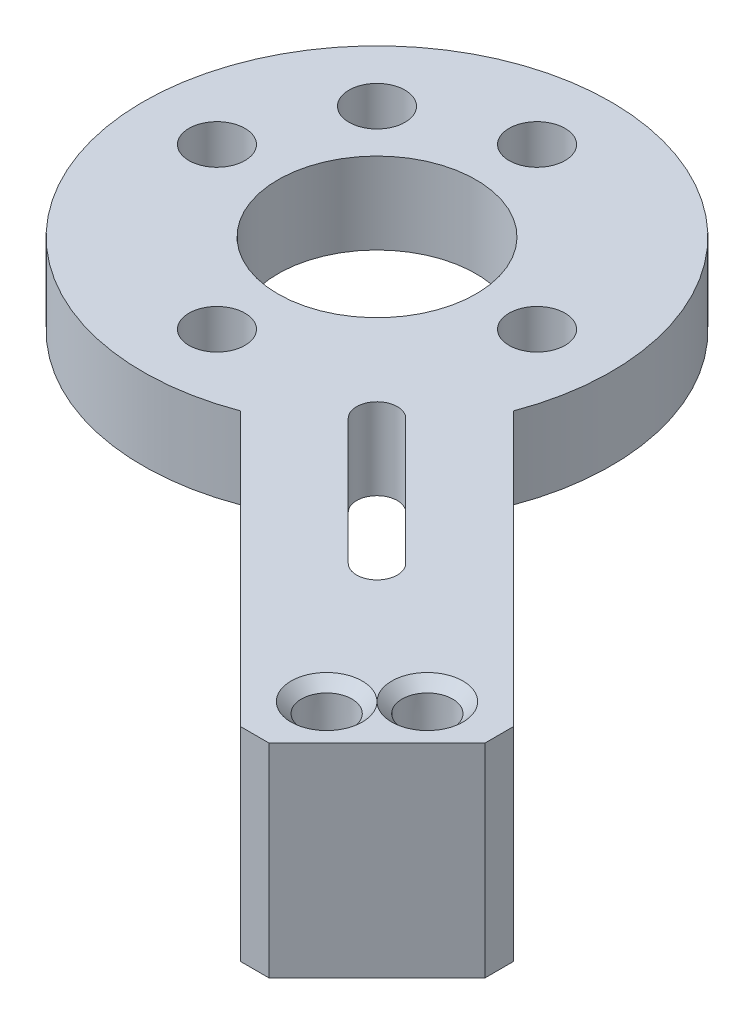
ISO-10303-21;
HEADER;
FILE_DESCRIPTION(('STEP AP214'),'2;1');
FILE_NAME('part.step','',(''),(''),'','','');
FILE_SCHEMA(('AUTOMOTIVE_DESIGN { 1 0 10303 214 1 1 1 1 }'));
ENDSEC;
DATA;
#1=APPLICATION_CONTEXT('core data for automotive mechanical design processes');
#2=APPLICATION_PROTOCOL_DEFINITION('international standard','automotive_design',2000,#1);
#3=PRODUCT_CONTEXT('',#1,'mechanical');
#4=PRODUCT('Part','Part','',(#3));
#5=PRODUCT_RELATED_PRODUCT_CATEGORY('part','',(#4));
#6=PRODUCT_DEFINITION_FORMATION('','',#4);
#7=PRODUCT_DEFINITION_CONTEXT('part definition',#1,'design');
#8=PRODUCT_DEFINITION('design','',#6,#7);
#9=PRODUCT_DEFINITION_SHAPE('','',#8);
#10=(LENGTH_UNIT() NAMED_UNIT(*) SI_UNIT(.MILLI.,.METRE.));
#11=(NAMED_UNIT(*) PLANE_ANGLE_UNIT() SI_UNIT($,.RADIAN.));
#12=(NAMED_UNIT(*) SI_UNIT($,.STERADIAN.) SOLID_ANGLE_UNIT());
#13=UNCERTAINTY_MEASURE_WITH_UNIT(LENGTH_MEASURE(1.E-05),#10,'distance_accuracy_value','');
#14=(GEOMETRIC_REPRESENTATION_CONTEXT(3) GLOBAL_UNCERTAINTY_ASSIGNED_CONTEXT((#13)) GLOBAL_UNIT_ASSIGNED_CONTEXT((#10,
#11,#12)) REPRESENTATION_CONTEXT('',''));
#15=CARTESIAN_POINT('',(0.,0.,0.));
#16=DIRECTION('',(0.,0.,1.));
#17=DIRECTION('',(1.,0.,0.));
#18=AXIS2_PLACEMENT_3D('',#15,#16,#17);
#19=CARTESIAN_POINT('',(15.7331258814007,0.,0.));
#20=DIRECTION('',(0.,1.,0.));
#21=DIRECTION('',(0.,0.,1.));
#22=AXIS2_PLACEMENT_3D('',#19,#20,#21);
#23=PLANE('',#22);
#24=DIRECTION('',(-0.708390939548997,0.,-0.705820286450375));
#25=VECTOR('',#24,1.);
#26=CARTESIAN_POINT('',(17.093291666069,0.,-1.36511961563089));
#27=LINE('',#26,#25);
#28=CARTESIAN_POINT('',(44.8804760190714,0.,26.321228874614));
#29=VERTEX_POINT('',#28);
#30=CARTESIAN_POINT('',(32.8277184088157,0.,14.3122090607754));
#31=VERTEX_POINT('',#30);
#32=EDGE_CURVE('E176',#29,#31,#27,.T.);
#33=ORIENTED_EDGE('',*,*,#32,.T.);
#34=CARTESIAN_POINT('',(31.1823897810028,0.,15.4492638996021));
#35=DIRECTION('',(0.,1.,0.));
#36=DIRECTION('',(0.,0.,1.));
#37=AXIS2_PLACEMENT_3D('',#34,#35,#36);
#38=CIRCLE('',#37,2.);
#39=CARTESIAN_POINT('',(29.7681762186297,0.,16.8634774619752));
#40=VERTEX_POINT('',#39);
#41=EDGE_CURVE('E152',#31,#40,#38,.T.);
#42=ORIENTED_EDGE('',*,*,#41,.T.);
#43=DIRECTION('',(0.707106781186548,0.,0.707106781186548));
#44=VECTOR('',#43,1.);
#45=CARTESIAN_POINT('',(14.3189123190276,0.,1.41421356237309));
#46=LINE('',#45,#44);
#47=CARTESIAN_POINT('',(42.1102951840181,0.,29.2055964273636));
#48=VERTEX_POINT('',#47);
#49=EDGE_CURVE('E185',#40,#48,#46,.T.);
#50=ORIENTED_EDGE('',*,*,#49,.T.);
#51=CARTESIAN_POINT('',(43.5245087463912,0.,27.7913828649905));
#52=DIRECTION('',(0.,1.,0.));
#53=DIRECTION('',(0.,0.,1.));
#54=AXIS2_PLACEMENT_3D('',#51,#52,#53);
#55=CIRCLE('',#54,2.);
#56=EDGE_CURVE('E182',#48,#29,#55,.T.);
#57=ORIENTED_EDGE('',*,*,#56,.T.);
#58=EDGE_LOOP('',(#33,#42,#50,#57));
#59=FACE_BOUND('',#58,.T.);
#60=CARTESIAN_POINT('',(15.7331258814007,0.,0.));
#61=DIRECTION('',(0.,1.,0.));
#62=DIRECTION('',(0.,0.,1.));
#63=AXIS2_PLACEMENT_3D('',#60,#61,#62);
#64=CIRCLE('',#63,9.73312588140068);
#65=CARTESIAN_POINT('',(15.7331258814007,0.,9.73312588140068));
#66=VERTEX_POINT('',#65);
#67=EDGE_CURVE('E217',#66,#66,#64,.T.);
#68=ORIENTED_EDGE('',*,*,#67,.T.);
#69=EDGE_LOOP('',(#68));
#70=FACE_BOUND('',#69,.T.);
#71=CARTESIAN_POINT('',(4.60812588140062,0.,-11.1249999999999));
#72=DIRECTION('',(0.,1.,0.));
#73=DIRECTION('',(0.,0.,1.));
#74=AXIS2_PLACEMENT_3D('',#71,#72,#73);
#75=CIRCLE('',#74,2.75);
#76=CARTESIAN_POINT('',(4.60812588140062,0.,-8.37499999999994));
#77=VERTEX_POINT('',#76);
#78=EDGE_CURVE('E221',#77,#77,#75,.T.);
#79=ORIENTED_EDGE('',*,*,#78,.T.);
#80=EDGE_LOOP('',(#79));
#81=FACE_BOUND('',#80,.T.);
#82=CARTESIAN_POINT('',(15.7331258814007,0.,15.7331258814007));
#83=DIRECTION('',(0.,1.,0.));
#84=DIRECTION('',(0.,0.,1.));
#85=AXIS2_PLACEMENT_3D('',#82,#83,#84);
#86=CIRCLE('',#85,2.75);
#87=CARTESIAN_POINT('',(15.7331258814007,0.,18.4831258814007));
#88=VERTEX_POINT('',#87);
#89=EDGE_CURVE('E227',#88,#88,#86,.T.);
#90=ORIENTED_EDGE('',*,*,#89,.T.);
#91=EDGE_LOOP('',(#90));
#92=FACE_BOUND('',#91,.T.);
#93=CARTESIAN_POINT('',(15.7331258814007,0.,-15.7331258814007));
#94=DIRECTION('',(0.,1.,0.));
#95=DIRECTION('',(0.,0.,1.));
#96=AXIS2_PLACEMENT_3D('',#93,#94,#95);
#97=CIRCLE('',#96,2.75);
#98=CARTESIAN_POINT('',(15.7331258814007,0.,-12.9831258814007));
#99=VERTEX_POINT('',#98);
#100=EDGE_CURVE('E233',#99,#99,#97,.T.);
#101=ORIENTED_EDGE('',*,*,#100,.T.);
#102=EDGE_LOOP('',(#101));
#103=FACE_BOUND('',#102,.T.);
#104=CARTESIAN_POINT('',(31.4662517628014,0.,0.));
#105=DIRECTION('',(0.,1.,0.));
#106=DIRECTION('',(0.,0.,1.));
#107=AXIS2_PLACEMENT_3D('',#104,#105,#106);
#108=CIRCLE('',#107,2.75);
#109=CARTESIAN_POINT('',(31.4662517628014,0.,2.75));
#110=VERTEX_POINT('',#109);
#111=EDGE_CURVE('E239',#110,#110,#108,.T.);
#112=ORIENTED_EDGE('',*,*,#111,.T.);
#113=EDGE_LOOP('',(#112));
#114=FACE_BOUND('',#113,.T.);
#115=CARTESIAN_POINT('',(0.,0.,0.));
#116=DIRECTION('',(0.,1.,0.));
#117=DIRECTION('',(0.,0.,1.));
#118=AXIS2_PLACEMENT_3D('',#115,#116,#117);
#119=CIRCLE('',#118,2.75);
#120=CARTESIAN_POINT('',(0.,0.,2.75));
#121=VERTEX_POINT('',#120);
#122=EDGE_CURVE('E245',#121,#121,#119,.T.);
#123=ORIENTED_EDGE('',*,*,#122,.T.);
#124=EDGE_LOOP('',(#123));
#125=FACE_BOUND('',#124,.T.);
#126=DIRECTION('',(-0.707106781186548,0.,-0.707106781186547));
#127=VECTOR('',#126,1.);
#128=CARTESIAN_POINT('',(65.5462247937334,0.,36.3780700697883));
#129=LINE('',#128,#127);
#130=CARTESIAN_POINT('',(54.6018265058654,0.,25.4336717819203));
#131=VERTEX_POINT('',#130);
#132=CARTESIAN_POINT('',(37.2619535462715,0.,8.09379882232644));
#133=VERTEX_POINT('',#132);
#134=EDGE_CURVE('E251',#131,#133,#129,.T.);
#135=ORIENTED_EDGE('',*,*,#134,.F.);
#136=DIRECTION('',(-0.707106781186547,0.,0.707106781186548));
#137=VECTOR('',#136,1.);
#138=CARTESIAN_POINT('',(41.166797663321,0.,38.8687006244647));
#139=LINE('',#138,#137);
#140=CARTESIAN_POINT('',(41.166797663321,0.,38.8687006244647));
#141=VERTEX_POINT('',#140);
#142=EDGE_CURVE('E291',#131,#141,#139,.T.);
#143=ORIENTED_EDGE('',*,*,#142,.T.);
#144=DIRECTION('',(0.707106781186548,0.,0.707106781186547));
#145=VECTOR('',#144,1.);
#146=CARTESIAN_POINT('',(52.111195951189,0.,49.8130989123327));
#147=LINE('',#146,#145);
#148=CARTESIAN_POINT('',(23.8269247037271,0.,21.5288276648708));
#149=VERTEX_POINT('',#148);
#150=EDGE_CURVE('E257',#149,#141,#147,.T.);
#151=ORIENTED_EDGE('',*,*,#150,.F.);
#152=CARTESIAN_POINT('',(15.7331258814007,0.,0.));
#153=DIRECTION('',(0.,1.,0.));
#154=DIRECTION('',(0.,0.,1.));
#155=AXIS2_PLACEMENT_3D('',#152,#153,#154);
#156=CIRCLE('',#155,23.);
#157=EDGE_CURVE('E267',#133,#149,#156,.T.);
#158=ORIENTED_EDGE('',*,*,#157,.F.);
#159=EDGE_LOOP('',(#135,#143,#151,#158));
#160=FACE_BOUND('',#159,.T.);
#161=ADVANCED_FACE('F39',(#59,#70,#81,#92,#103,#114,#125,#160),#23,.F.);
#162=CARTESIAN_POINT('',(15.7331258814007,8.,0.));
#163=DIRECTION('',(0.,1.,0.));
#164=DIRECTION('',(0.,0.,1.));
#165=AXIS2_PLACEMENT_3D('',#162,#163,#164);
#166=PLANE('',#165);
#167=CARTESIAN_POINT('',(57.7680502006814,8.,37.0851768509749));
#168=DIRECTION('',(0.,1.,0.));
#169=DIRECTION('',(0.,0.,1.));
#170=AXIS2_PLACEMENT_3D('',#167,#168,#169);
#171=CIRCLE('',#170,3.50000000000011);
#172=CARTESIAN_POINT('',(55.2931764665285,8.,39.5600505851278));
#173=VERTEX_POINT('',#172);
#174=CARTESIAN_POINT('',(57.7680502006814,8.,40.5851768509749));
#175=VERTEX_POINT('',#174);
#176=EDGE_CURVE('E55',#173,#175,#171,.F.);
#177=ORIENTED_EDGE('',*,*,#176,.T.);
#178=CARTESIAN_POINT('',(57.7680502006814,8.,37.0851768509749));
#179=DIRECTION('',(0.,1.,0.));
#180=DIRECTION('',(0.,0.,1.));
#181=AXIS2_PLACEMENT_3D('',#178,#179,#180);
#182=CIRCLE('',#181,3.50000000000011);
#183=EDGE_CURVE('E48',#175,#173,#182,.F.);
#184=ORIENTED_EDGE('',*,*,#183,.T.);
#185=CARTESIAN_POINT('',(52.8183027323756,8.,42.0349243192807));
#186=DIRECTION('',(0.,1.,0.));
#187=DIRECTION('',(0.,0.,1.));
#188=AXIS2_PLACEMENT_3D('',#185,#186,#187);
#189=CIRCLE('',#188,3.5);
#190=CARTESIAN_POINT('',(52.8183027323756,8.,45.5349243192807));
#191=VERTEX_POINT('',#190);
#192=EDGE_CURVE('E60',#173,#191,#189,.F.);
#193=ORIENTED_EDGE('',*,*,#192,.T.);
#194=CARTESIAN_POINT('',(52.8183027323756,8.,42.0349243192807));
#195=DIRECTION('',(0.,1.,0.));
#196=DIRECTION('',(0.,0.,1.));
#197=AXIS2_PLACEMENT_3D('',#194,#195,#196);
#198=CIRCLE('',#197,3.5);
#199=EDGE_CURVE('E301',#191,#173,#198,.F.);
#200=ORIENTED_EDGE('',*,*,#199,.T.);
#201=EDGE_LOOP('',(#177,#184,#193,#200));
#202=FACE_BOUND('',#201,.T.);
#203=CARTESIAN_POINT('',(31.1823897810028,8.00000000000001,15.4492638996021));
#204=DIRECTION('',(0.,-1.,0.));
#205=DIRECTION('',(0.,0.,-1.));
#206=AXIS2_PLACEMENT_3D('',#203,#204,#205);
#207=CIRCLE('',#206,2.);
#208=CARTESIAN_POINT('',(29.7681762186297,8.00000000000001,16.8634774619752));
#209=VERTEX_POINT('',#208);
#210=CARTESIAN_POINT('',(32.8277184088157,8.00000000000001,14.3122090607754));
#211=VERTEX_POINT('',#210);
#212=EDGE_CURVE('E149',#209,#211,#207,.T.);
#213=ORIENTED_EDGE('',*,*,#212,.T.);
#214=DIRECTION('',(0.708390939548997,0.,0.705820286450375));
#215=VECTOR('',#214,1.);
#216=CARTESIAN_POINT('',(44.8804760190714,8.00000000000001,26.321228874614));
#217=LINE('',#216,#215);
#218=CARTESIAN_POINT('',(44.8804760190714,8.,26.321228874614));
#219=VERTEX_POINT('',#218);
#220=EDGE_CURVE('E160',#211,#219,#217,.T.);
#221=ORIENTED_EDGE('',*,*,#220,.T.);
#222=CARTESIAN_POINT('',(43.5245087463912,8.00000000000001,27.7913828649905));
#223=DIRECTION('',(0.,-1.,0.));
#224=DIRECTION('',(0.,0.,-1.));
#225=AXIS2_PLACEMENT_3D('',#222,#223,#224);
#226=CIRCLE('',#225,2.);
#227=CARTESIAN_POINT('',(42.1102951840181,8.00000000000001,29.2055964273636));
#228=VERTEX_POINT('',#227);
#229=EDGE_CURVE('E165',#219,#228,#226,.T.);
#230=ORIENTED_EDGE('',*,*,#229,.T.);
#231=DIRECTION('',(-0.707106781186547,0.,-0.707106781186547));
#232=VECTOR('',#231,1.);
#233=CARTESIAN_POINT('',(29.7681762186297,8.00000000000001,16.8634774619752));
#234=LINE('',#233,#232);
#235=EDGE_CURVE('E156',#228,#209,#234,.T.);
#236=ORIENTED_EDGE('',*,*,#235,.T.);
#237=EDGE_LOOP('',(#213,#221,#230,#236));
#238=FACE_BOUND('',#237,.T.);
#239=CARTESIAN_POINT('',(4.60812588140062,8.,-11.1249999999999));
#240=DIRECTION('',(0.,1.,0.));
#241=DIRECTION('',(0.,0.,1.));
#242=AXIS2_PLACEMENT_3D('',#239,#240,#241);
#243=CIRCLE('',#242,2.75);
#244=CARTESIAN_POINT('',(4.60812588140062,8.,-8.37499999999994));
#245=VERTEX_POINT('',#244);
#246=EDGE_CURVE('E224',#245,#245,#243,.T.);
#247=ORIENTED_EDGE('',*,*,#246,.F.);
#248=EDGE_LOOP('',(#247));
#249=FACE_BOUND('',#248,.T.);
#250=CARTESIAN_POINT('',(15.7331258814007,8.,-15.7331258814007));
#251=DIRECTION('',(0.,1.,0.));
#252=DIRECTION('',(0.,0.,1.));
#253=AXIS2_PLACEMENT_3D('',#250,#251,#252);
#254=CIRCLE('',#253,2.75);
#255=CARTESIAN_POINT('',(15.7331258814007,8.,-12.9831258814007));
#256=VERTEX_POINT('',#255);
#257=EDGE_CURVE('E236',#256,#256,#254,.T.);
#258=ORIENTED_EDGE('',*,*,#257,.F.);
#259=EDGE_LOOP('',(#258));
#260=FACE_BOUND('',#259,.T.);
#261=CARTESIAN_POINT('',(0.,8.,0.));
#262=DIRECTION('',(0.,1.,0.));
#263=DIRECTION('',(0.,0.,1.));
#264=AXIS2_PLACEMENT_3D('',#261,#262,#263);
#265=CIRCLE('',#264,2.75);
#266=CARTESIAN_POINT('',(0.,8.,2.75));
#267=VERTEX_POINT('',#266);
#268=EDGE_CURVE('E248',#267,#267,#265,.T.);
#269=ORIENTED_EDGE('',*,*,#268,.F.);
#270=EDGE_LOOP('',(#269));
#271=FACE_BOUND('',#270,.T.);
#272=DIRECTION('',(0.707106781186547,0.,-0.707106781186548));
#273=VECTOR('',#272,1.);
#274=CARTESIAN_POINT('',(58.8287103724612,8.,43.0955844910605));
#275=LINE('',#274,#273);
#276=CARTESIAN_POINT('',(53.5254095135621,8.,48.3988853499596));
#277=VERTEX_POINT('',#276);
#278=CARTESIAN_POINT('',(64.1320112313603,8.,37.7922836321614));
#279=VERTEX_POINT('',#278);
#280=EDGE_CURVE('E262',#277,#279,#275,.T.);
#281=ORIENTED_EDGE('',*,*,#280,.T.);
#282=DIRECTION('',(0.,0.,1.));
#283=VECTOR('',#282,1.);
#284=CARTESIAN_POINT('',(64.1320112313605,8.,2.37471015302104E-13));
#285=LINE('',#284,#283);
#286=CARTESIAN_POINT('',(64.1320112313603,8.,34.9638565074153));
#287=VERTEX_POINT('',#286);
#288=EDGE_CURVE('E284',#279,#287,#285,.F.);
#289=ORIENTED_EDGE('',*,*,#288,.T.);
#290=DIRECTION('',(-0.707106781186548,0.,-0.707106781186547));
#291=VECTOR('',#290,1.);
#292=CARTESIAN_POINT('',(65.5462247937334,8.,36.3780700697883));
#293=LINE('',#292,#291);
#294=CARTESIAN_POINT('',(37.2619535462715,8.,8.09379882232644));
#295=VERTEX_POINT('',#294);
#296=EDGE_CURVE('E254',#287,#295,#293,.T.);
#297=ORIENTED_EDGE('',*,*,#296,.T.);
#298=CARTESIAN_POINT('',(15.7331258814007,8.,0.));
#299=DIRECTION('',(0.,1.,0.));
#300=DIRECTION('',(0.,0.,1.));
#301=AXIS2_PLACEMENT_3D('',#298,#299,#300);
#302=CIRCLE('',#301,23.);
#303=CARTESIAN_POINT('',(23.8269247037271,8.,21.5288276648708));
#304=VERTEX_POINT('',#303);
#305=EDGE_CURVE('E256',#295,#304,#302,.T.);
#306=ORIENTED_EDGE('',*,*,#305,.T.);
#307=DIRECTION('',(0.707106781186548,0.,0.707106781186547));
#308=VECTOR('',#307,1.);
#309=CARTESIAN_POINT('',(52.111195951189,8.,49.8130989123327));
#310=LINE('',#309,#308);
#311=CARTESIAN_POINT('',(50.6969823888159,8.,48.3988853499596));
#312=VERTEX_POINT('',#311);
#313=EDGE_CURVE('E259',#304,#312,#310,.T.);
#314=ORIENTED_EDGE('',*,*,#313,.T.);
#315=DIRECTION('',(-1.,0.,0.));
#316=VECTOR('',#315,1.);
#317=CARTESIAN_POINT('',(15.7331258814007,8.,48.3988853499596));
#318=LINE('',#317,#316);
#319=EDGE_CURVE('E282',#312,#277,#318,.F.);
#320=ORIENTED_EDGE('',*,*,#319,.T.);
#321=EDGE_LOOP('',(#281,#289,#297,#306,#314,#320));
#322=FACE_BOUND('',#321,.T.);
#323=CARTESIAN_POINT('',(31.4662517628014,8.,0.));
#324=DIRECTION('',(0.,1.,0.));
#325=DIRECTION('',(0.,0.,1.));
#326=AXIS2_PLACEMENT_3D('',#323,#324,#325);
#327=CIRCLE('',#326,2.75);
#328=CARTESIAN_POINT('',(31.4662517628014,8.,2.75));
#329=VERTEX_POINT('',#328);
#330=EDGE_CURVE('E242',#329,#329,#327,.T.);
#331=ORIENTED_EDGE('',*,*,#330,.F.);
#332=EDGE_LOOP('',(#331));
#333=FACE_BOUND('',#332,.T.);
#334=CARTESIAN_POINT('',(15.7331258814007,8.,15.7331258814007));
#335=DIRECTION('',(0.,1.,0.));
#336=DIRECTION('',(0.,0.,1.));
#337=AXIS2_PLACEMENT_3D('',#334,#335,#336);
#338=CIRCLE('',#337,2.75);
#339=CARTESIAN_POINT('',(15.7331258814007,8.,18.4831258814007));
#340=VERTEX_POINT('',#339);
#341=EDGE_CURVE('E230',#340,#340,#338,.T.);
#342=ORIENTED_EDGE('',*,*,#341,.F.);
#343=EDGE_LOOP('',(#342));
#344=FACE_BOUND('',#343,.T.);
#345=CARTESIAN_POINT('',(15.7331258814007,8.,0.));
#346=DIRECTION('',(0.,1.,0.));
#347=DIRECTION('',(0.,0.,1.));
#348=AXIS2_PLACEMENT_3D('',#345,#346,#347);
#349=CIRCLE('',#348,9.73312588140068);
#350=CARTESIAN_POINT('',(15.7331258814007,8.,9.73312588140068));
#351=VERTEX_POINT('',#350);
#352=EDGE_CURVE('E218',#351,#351,#349,.T.);
#353=ORIENTED_EDGE('',*,*,#352,.F.);
#354=EDGE_LOOP('',(#353));
#355=FACE_BOUND('',#354,.T.);
#356=ADVANCED_FACE('F167',(#202,#238,#249,#260,#271,#322,#333,#344,#355),#166,.T.);
#357=CARTESIAN_POINT('',(65.5462247937334,8.,36.3780700697883));
#358=DIRECTION('',(-0.707106781186547,0.,0.707106781186548));
#359=DIRECTION('',(0.707106781186548,0.,0.707106781186547));
#360=AXIS2_PLACEMENT_3D('',#357,#358,#359);
#361=PLANE('',#360);
#362=ORIENTED_EDGE('',*,*,#296,.F.);
#363=DIRECTION('',(0.,-1.,0.));
#364=VECTOR('',#363,1.);
#365=CARTESIAN_POINT('',(64.1320112313603,8.,34.9638565074153));
#366=LINE('',#365,#364);
#367=CARTESIAN_POINT('',(64.1320112313603,-12.,34.9638565074153));
#368=VERTEX_POINT('',#367);
#369=EDGE_CURVE('E276',#287,#368,#366,.T.);
#370=ORIENTED_EDGE('',*,*,#369,.T.);
#371=DIRECTION('',(0.707106781186548,0.,0.707106781186548));
#372=VECTOR('',#371,1.);
#373=CARTESIAN_POINT('',(64.1320112313603,-12.,34.9638565074153));
#374=LINE('',#373,#372);
#375=CARTESIAN_POINT('',(56.0160400682385,-12.,26.8478853442934));
#376=VERTEX_POINT('',#375);
#377=EDGE_CURVE('E202',#376,#368,#374,.T.);
#378=ORIENTED_EDGE('',*,*,#377,.F.);
#379=DIRECTION('',(0.,1.,0.));
#380=VECTOR('',#379,1.);
#381=CARTESIAN_POINT('',(56.0160400682385,-12.,26.8478853442934));
#382=LINE('',#381,#380);
#383=CARTESIAN_POINT('',(56.0160400682385,-2.,26.8478853442934));
#384=VERTEX_POINT('',#383);
#385=EDGE_CURVE('E211',#376,#384,#382,.T.);
#386=ORIENTED_EDGE('',*,*,#385,.T.);
#387=DIRECTION('',(0.499999999999998,-0.707106781186551,0.499999999999998));
#388=VECTOR('',#387,1.);
#389=CARTESIAN_POINT('',(57.2455985250531,-3.73885824535788,28.0774438011081));
#390=LINE('',#389,#388);
#391=EDGE_CURVE('E293',#384,#131,#390,.F.);
#392=ORIENTED_EDGE('',*,*,#391,.T.);
#393=ORIENTED_EDGE('',*,*,#134,.T.);
#394=DIRECTION('',(0.,-1.,0.));
#395=VECTOR('',#394,1.);
#396=CARTESIAN_POINT('',(37.2619535462715,8.,8.09379882232644));
#397=LINE('',#396,#395);
#398=EDGE_CURVE('E273',#295,#133,#397,.T.);
#399=ORIENTED_EDGE('',*,*,#398,.F.);
#400=EDGE_LOOP('',(#362,#370,#378,#386,#392,#393,#399));
#401=FACE_BOUND('',#400,.T.);
#402=ADVANCED_FACE('F364',(#401),#361,.F.);
#403=CARTESIAN_POINT('',(15.7331258814007,8.,0.));
#404=DIRECTION('',(0.,-1.,0.));
#405=DIRECTION('',(0.,0.,-1.));
#406=AXIS2_PLACEMENT_3D('',#403,#404,#405);
#407=CYLINDRICAL_SURFACE('',#406,23.);
#408=ORIENTED_EDGE('',*,*,#157,.T.);
#409=DIRECTION('',(0.,-1.,0.));
#410=VECTOR('',#409,1.);
#411=CARTESIAN_POINT('',(23.8269247037271,8.,21.5288276648708));
#412=LINE('',#411,#410);
#413=EDGE_CURVE('E265',#304,#149,#412,.T.);
#414=ORIENTED_EDGE('',*,*,#413,.F.);
#415=ORIENTED_EDGE('',*,*,#305,.F.);
#416=ORIENTED_EDGE('',*,*,#398,.T.);
#417=EDGE_LOOP('',(#408,#414,#415,#416));
#418=FACE_BOUND('',#417,.T.);
#419=ADVANCED_FACE('F366',(#418),#407,.T.);
#420=CARTESIAN_POINT('',(52.111195951189,8.,49.8130989123327));
#421=DIRECTION('',(0.707106781186547,0.,-0.707106781186548));
#422=DIRECTION('',(-0.707106781186548,0.,-0.707106781186547));
#423=AXIS2_PLACEMENT_3D('',#420,#421,#422);
#424=PLANE('',#423);
#425=ORIENTED_EDGE('',*,*,#150,.T.);
#426=DIRECTION('',(-0.499999999999998,0.707106781186551,-0.499999999999998));
#427=VECTOR('',#426,1.);
#428=CARTESIAN_POINT('',(43.8105696825088,-3.73885824535788,41.5124726436525));
#429=LINE('',#428,#427);
#430=CARTESIAN_POINT('',(42.5810112256941,-2.,40.2829141868378));
#431=VERTEX_POINT('',#430);
#432=EDGE_CURVE('E295',#141,#431,#429,.F.);
#433=ORIENTED_EDGE('',*,*,#432,.T.);
#434=DIRECTION('',(0.,1.,0.));
#435=VECTOR('',#434,1.);
#436=CARTESIAN_POINT('',(42.5810112256941,-12.,40.2829141868378));
#437=LINE('',#436,#435);
#438=CARTESIAN_POINT('',(42.5810112256941,-12.,40.2829141868378));
#439=VERTEX_POINT('',#438);
#440=EDGE_CURVE('E214',#439,#431,#437,.T.);
#441=ORIENTED_EDGE('',*,*,#440,.F.);
#442=DIRECTION('',(-0.707106781186548,0.,-0.707106781186547));
#443=VECTOR('',#442,1.);
#444=CARTESIAN_POINT('',(42.5810112256941,-12.,40.2829141868378));
#445=LINE('',#444,#443);
#446=CARTESIAN_POINT('',(50.6969823888159,-12.,48.3988853499596));
#447=VERTEX_POINT('',#446);
#448=EDGE_CURVE('E198',#447,#439,#445,.T.);
#449=ORIENTED_EDGE('',*,*,#448,.F.);
#450=DIRECTION('',(0.,1.,0.));
#451=VECTOR('',#450,1.);
#452=CARTESIAN_POINT('',(50.6969823888159,8.,48.3988853499596));
#453=LINE('',#452,#451);
#454=EDGE_CURVE('E286',#447,#312,#453,.T.);
#455=ORIENTED_EDGE('',*,*,#454,.T.);
#456=ORIENTED_EDGE('',*,*,#313,.F.);
#457=ORIENTED_EDGE('',*,*,#413,.T.);
#458=EDGE_LOOP('',(#425,#433,#441,#449,#455,#456,#457));
#459=FACE_BOUND('',#458,.T.);
#460=ADVANCED_FACE('F336',(#459),#424,.F.);
#461=CARTESIAN_POINT('',(58.8287103724612,8.,43.0955844910605));
#462=DIRECTION('',(-0.707106781186547,0.,-0.707106781186547));
#463=DIRECTION('',(-0.707106781186548,0.,0.707106781186548));
#464=AXIS2_PLACEMENT_3D('',#461,#462,#463);
#465=PLANE('',#464);
#466=DIRECTION('',(0.,-1.,0.));
#467=VECTOR('',#466,1.);
#468=CARTESIAN_POINT('',(53.5254095135621,8.,48.3988853499596));
#469=LINE('',#468,#467);
#470=CARTESIAN_POINT('',(53.5254095135621,-12.,48.3988853499596));
#471=VERTEX_POINT('',#470);
#472=EDGE_CURVE('E278',#277,#471,#469,.T.);
#473=ORIENTED_EDGE('',*,*,#472,.T.);
#474=DIRECTION('',(-0.707106781186547,0.,0.707106781186547));
#475=VECTOR('',#474,1.);
#476=CARTESIAN_POINT('',(53.5254095135621,-12.,48.3988853499596));
#477=LINE('',#476,#475);
#478=CARTESIAN_POINT('',(64.1320112313603,-12.,37.7922836321614));
#479=VERTEX_POINT('',#478);
#480=EDGE_CURVE('E208',#479,#471,#477,.T.);
#481=ORIENTED_EDGE('',*,*,#480,.F.);
#482=DIRECTION('',(0.,1.,0.));
#483=VECTOR('',#482,1.);
#484=CARTESIAN_POINT('',(64.1320112313603,8.,37.7922836321614));
#485=LINE('',#484,#483);
#486=EDGE_CURVE('E280',#479,#279,#485,.T.);
#487=ORIENTED_EDGE('',*,*,#486,.T.);
#488=ORIENTED_EDGE('',*,*,#280,.F.);
#489=EDGE_LOOP('',(#473,#481,#487,#488));
#490=FACE_BOUND('',#489,.T.);
#491=ADVANCED_FACE('F351',(#490),#465,.F.);
#492=CARTESIAN_POINT('',(0.,8.,0.));
#493=DIRECTION('',(0.,-1.,0.));
#494=DIRECTION('',(0.,0.,-1.));
#495=AXIS2_PLACEMENT_3D('',#492,#493,#494);
#496=CYLINDRICAL_SURFACE('',#495,2.75);
#497=ORIENTED_EDGE('',*,*,#268,.T.);
#498=EDGE_LOOP('',(#497));
#499=FACE_BOUND('',#498,.T.);
#500=ORIENTED_EDGE('',*,*,#122,.F.);
#501=EDGE_LOOP('',(#500));
#502=FACE_BOUND('',#501,.T.);
#503=ADVANCED_FACE('F386',(#499,#502),#496,.F.);
#504=CARTESIAN_POINT('',(31.4662517628014,8.,0.));
#505=DIRECTION('',(0.,-1.,0.));
#506=DIRECTION('',(0.,0.,-1.));
#507=AXIS2_PLACEMENT_3D('',#504,#505,#506);
#508=CYLINDRICAL_SURFACE('',#507,2.75);
#509=ORIENTED_EDGE('',*,*,#330,.T.);
#510=EDGE_LOOP('',(#509));
#511=FACE_BOUND('',#510,.T.);
#512=ORIENTED_EDGE('',*,*,#111,.F.);
#513=EDGE_LOOP('',(#512));
#514=FACE_BOUND('',#513,.T.);
#515=ADVANCED_FACE('F390',(#511,#514),#508,.F.);
#516=CARTESIAN_POINT('',(15.7331258814007,8.,-15.7331258814007));
#517=DIRECTION('',(0.,-1.,0.));
#518=DIRECTION('',(0.,0.,-1.));
#519=AXIS2_PLACEMENT_3D('',#516,#517,#518);
#520=CYLINDRICAL_SURFACE('',#519,2.75);
#521=ORIENTED_EDGE('',*,*,#257,.T.);
#522=EDGE_LOOP('',(#521));
#523=FACE_BOUND('',#522,.T.);
#524=ORIENTED_EDGE('',*,*,#100,.F.);
#525=EDGE_LOOP('',(#524));
#526=FACE_BOUND('',#525,.T.);
#527=ADVANCED_FACE('F395',(#523,#526),#520,.F.);
#528=CARTESIAN_POINT('',(15.7331258814007,8.,15.7331258814007));
#529=DIRECTION('',(0.,-1.,0.));
#530=DIRECTION('',(0.,0.,-1.));
#531=AXIS2_PLACEMENT_3D('',#528,#529,#530);
#532=CYLINDRICAL_SURFACE('',#531,2.75);
#533=ORIENTED_EDGE('',*,*,#341,.T.);
#534=EDGE_LOOP('',(#533));
#535=FACE_BOUND('',#534,.T.);
#536=ORIENTED_EDGE('',*,*,#89,.F.);
#537=EDGE_LOOP('',(#536));
#538=FACE_BOUND('',#537,.T.);
#539=ADVANCED_FACE('F402',(#535,#538),#532,.F.);
#540=CARTESIAN_POINT('',(4.60812588140062,8.,-11.1249999999999));
#541=DIRECTION('',(0.,-1.,0.));
#542=DIRECTION('',(0.,0.,-1.));
#543=AXIS2_PLACEMENT_3D('',#540,#541,#542);
#544=CYLINDRICAL_SURFACE('',#543,2.75);
#545=ORIENTED_EDGE('',*,*,#246,.T.);
#546=EDGE_LOOP('',(#545));
#547=FACE_BOUND('',#546,.T.);
#548=ORIENTED_EDGE('',*,*,#78,.F.);
#549=EDGE_LOOP('',(#548));
#550=FACE_BOUND('',#549,.T.);
#551=ADVANCED_FACE('F406',(#547,#550),#544,.F.);
#552=CARTESIAN_POINT('',(15.7331258814007,8.,0.));
#553=DIRECTION('',(0.,-1.,0.));
#554=DIRECTION('',(0.,0.,-1.));
#555=AXIS2_PLACEMENT_3D('',#552,#553,#554);
#556=CYLINDRICAL_SURFACE('',#555,9.73312588140068);
#557=ORIENTED_EDGE('',*,*,#352,.T.);
#558=EDGE_LOOP('',(#557));
#559=FACE_BOUND('',#558,.T.);
#560=ORIENTED_EDGE('',*,*,#67,.F.);
#561=EDGE_LOOP('',(#560));
#562=FACE_BOUND('',#561,.T.);
#563=ADVANCED_FACE('F410',(#559,#562),#556,.F.);
#564=CARTESIAN_POINT('',(64.1320112313603,8.,34.9638565074153));
#565=DIRECTION('',(-1.,0.,0.));
#566=DIRECTION('',(0.,-1.,0.));
#567=AXIS2_PLACEMENT_3D('',#564,#565,#566);
#568=PLANE('',#567);
#569=ORIENTED_EDGE('',*,*,#288,.F.);
#570=ORIENTED_EDGE('',*,*,#486,.F.);
#571=DIRECTION('',(0.,0.,1.));
#572=VECTOR('',#571,1.);
#573=CARTESIAN_POINT('',(64.1320112313603,-12.,37.7922836321614));
#574=LINE('',#573,#572);
#575=EDGE_CURVE('E205',#368,#479,#574,.T.);
#576=ORIENTED_EDGE('',*,*,#575,.F.);
#577=ORIENTED_EDGE('',*,*,#369,.F.);
#578=EDGE_LOOP('',(#569,#570,#576,#577));
#579=FACE_BOUND('',#578,.T.);
#580=ADVANCED_FACE('F348',(#579),#568,.F.);
#581=CARTESIAN_POINT('',(53.5254095135621,8.,48.3988853499596));
#582=DIRECTION('',(0.,0.,-1.));
#583=DIRECTION('',(0.,-1.,0.));
#584=AXIS2_PLACEMENT_3D('',#581,#582,#583);
#585=PLANE('',#584);
#586=ORIENTED_EDGE('',*,*,#319,.F.);
#587=ORIENTED_EDGE('',*,*,#454,.F.);
#588=DIRECTION('',(-1.,0.,0.));
#589=VECTOR('',#588,1.);
#590=CARTESIAN_POINT('',(50.6969823888159,-12.,48.3988853499596));
#591=LINE('',#590,#589);
#592=EDGE_CURVE('E195',#471,#447,#591,.T.);
#593=ORIENTED_EDGE('',*,*,#592,.F.);
#594=ORIENTED_EDGE('',*,*,#472,.F.);
#595=EDGE_LOOP('',(#586,#587,#593,#594));
#596=FACE_BOUND('',#595,.T.);
#597=ADVANCED_FACE('F333',(#596),#585,.F.);
#598=CARTESIAN_POINT('',(56.0160400682385,-12.,26.8478853442934));
#599=DIRECTION('',(0.707106781186548,0.,0.707106781186547));
#600=DIRECTION('',(0.707106781186547,0.,-0.707106781186548));
#601=AXIS2_PLACEMENT_3D('',#598,#599,#600);
#602=PLANE('',#601);
#603=ORIENTED_EDGE('',*,*,#440,.T.);
#604=DIRECTION('',(0.707106781186547,0.,-0.707106781186548));
#605=VECTOR('',#604,1.);
#606=CARTESIAN_POINT('',(56.0160400682385,-2.,26.8478853442934));
#607=LINE('',#606,#605);
#608=EDGE_CURVE('E288',#431,#384,#607,.T.);
#609=ORIENTED_EDGE('',*,*,#608,.T.);
#610=ORIENTED_EDGE('',*,*,#385,.F.);
#611=DIRECTION('',(0.707106781186547,0.,-0.707106781186548));
#612=VECTOR('',#611,1.);
#613=CARTESIAN_POINT('',(56.0160400682385,-12.,26.8478853442934));
#614=LINE('',#613,#612);
#615=EDGE_CURVE('E200',#439,#376,#614,.T.);
#616=ORIENTED_EDGE('',*,*,#615,.F.);
#617=EDGE_LOOP('',(#603,#609,#610,#616));
#618=FACE_BOUND('',#617,.T.);
#619=ADVANCED_FACE('F322',(#618),#602,.F.);
#620=CARTESIAN_POINT('',(0.,-12.,0.));
#621=DIRECTION('',(0.,1.,0.));
#622=DIRECTION('',(0.,0.,1.));
#623=AXIS2_PLACEMENT_3D('',#620,#621,#622);
#624=PLANE('',#623);
#625=CARTESIAN_POINT('',(57.7680502006814,-12.,37.0851768509749));
#626=DIRECTION('',(0.,1.,0.));
#627=DIRECTION('',(0.,0.,1.));
#628=AXIS2_PLACEMENT_3D('',#625,#626,#627);
#629=CIRCLE('',#628,2.1);
#630=CARTESIAN_POINT('',(57.7680502006814,-12.,39.1851768509749));
#631=VERTEX_POINT('',#630);
#632=EDGE_CURVE('E189',#631,#631,#629,.T.);
#633=ORIENTED_EDGE('',*,*,#632,.T.);
#634=EDGE_LOOP('',(#633));
#635=FACE_BOUND('',#634,.T.);
#636=CARTESIAN_POINT('',(52.8183027323756,-12.,42.0349243192807));
#637=DIRECTION('',(0.,1.,0.));
#638=DIRECTION('',(0.,0.,1.));
#639=AXIS2_PLACEMENT_3D('',#636,#637,#638);
#640=CIRCLE('',#639,2.1);
#641=CARTESIAN_POINT('',(52.8183027323756,-12.,44.1349243192807));
#642=VERTEX_POINT('',#641);
#643=EDGE_CURVE('E192',#642,#642,#640,.T.);
#644=ORIENTED_EDGE('',*,*,#643,.T.);
#645=EDGE_LOOP('',(#644));
#646=FACE_BOUND('',#645,.T.);
#647=ORIENTED_EDGE('',*,*,#592,.T.);
#648=ORIENTED_EDGE('',*,*,#448,.T.);
#649=ORIENTED_EDGE('',*,*,#615,.T.);
#650=ORIENTED_EDGE('',*,*,#377,.T.);
#651=ORIENTED_EDGE('',*,*,#575,.T.);
#652=ORIENTED_EDGE('',*,*,#480,.T.);
#653=EDGE_LOOP('',(#647,#648,#649,#650,#651,#652));
#654=FACE_BOUND('',#653,.T.);
#655=ADVANCED_FACE('F319',(#635,#646,#654),#624,.F.);
#656=CARTESIAN_POINT('',(52.8183027323756,8.,42.0349243192807));
#657=DIRECTION('',(0.,1.,0.));
#658=DIRECTION('',(0.,0.,1.));
#659=AXIS2_PLACEMENT_3D('',#656,#657,#658);
#660=CONICAL_SURFACE('',#659,2.5,0.0199973339731506);
#661=CARTESIAN_POINT('',(52.8183027323756,6.97959183673469,42.0349243192807));
#662=DIRECTION('',(0.,1.,0.));
#663=DIRECTION('',(0.,0.,1.));
#664=AXIS2_PLACEMENT_3D('',#661,#662,#663);
#665=CIRCLE('',#664,2.47959183673469);
#666=CARTESIAN_POINT('',(52.8183027323756,6.97959183673469,44.5145161560154));
#667=VERTEX_POINT('',#666);
#668=EDGE_CURVE('E11',#667,#667,#665,.T.);
#669=ORIENTED_EDGE('',*,*,#668,.T.);
#670=EDGE_LOOP('',(#669));
#671=FACE_BOUND('',#670,.T.);
#672=ORIENTED_EDGE('',*,*,#643,.F.);
#673=EDGE_LOOP('',(#672));
#674=FACE_BOUND('',#673,.T.);
#675=ADVANCED_FACE('F315',(#671,#674),#660,.F.);
#676=CARTESIAN_POINT('',(57.7680502006814,-12.,37.0851768509749));
#677=DIRECTION('',(0.,1.,0.));
#678=DIRECTION('',(0.,0.,1.));
#679=AXIS2_PLACEMENT_3D('',#676,#677,#678);
#680=CONICAL_SURFACE('',#679,2.1,0.0199973339731484);
#681=CARTESIAN_POINT('',(57.7680502006814,6.97959183673451,37.0851768509748));
#682=DIRECTION('',(0.,-1.,0.));
#683=DIRECTION('',(0.,0.,-1.));
#684=AXIS2_PLACEMENT_3D('',#681,#682,#683);
#685=CIRCLE('',#684,2.47959183673465);
#686=CARTESIAN_POINT('',(57.7680502006814,6.97959183673452,34.6055850142402));
#687=VERTEX_POINT('',#686);
#688=EDGE_CURVE('E297',#687,#687,#685,.F.);
#689=ORIENTED_EDGE('',*,*,#688,.T.);
#690=EDGE_LOOP('',(#689));
#691=FACE_BOUND('',#690,.T.);
#692=ORIENTED_EDGE('',*,*,#632,.F.);
#693=EDGE_LOOP('',(#692));
#694=FACE_BOUND('',#693,.T.);
#695=ADVANCED_FACE('F311',(#691,#694),#680,.F.);
#696=CARTESIAN_POINT('',(56.0160400682385,-2.,26.8478853442934));
#697=DIRECTION('',(-0.500000000000003,-0.707106781186544,-0.500000000000002));
#698=DIRECTION('',(-0.707106781186547,0.,0.707106781186548));
#699=AXIS2_PLACEMENT_3D('',#696,#697,#698);
#700=PLANE('',#699);
#701=ORIENTED_EDGE('',*,*,#432,.F.);
#702=ORIENTED_EDGE('',*,*,#142,.F.);
#703=ORIENTED_EDGE('',*,*,#391,.F.);
#704=ORIENTED_EDGE('',*,*,#608,.F.);
#705=EDGE_LOOP('',(#701,#702,#703,#704));
#706=FACE_BOUND('',#705,.T.);
#707=ADVANCED_FACE('F314',(#706),#700,.T.);
#708=CARTESIAN_POINT('',(31.1823897810028,8.00000000000001,15.4492638996021));
#709=DIRECTION('',(0.,-1.,0.));
#710=DIRECTION('',(0.,0.,-1.));
#711=AXIS2_PLACEMENT_3D('',#708,#709,#710);
#712=CYLINDRICAL_SURFACE('',#711,2.);
#713=DIRECTION('',(0.,-1.,0.));
#714=VECTOR('',#713,1.);
#715=CARTESIAN_POINT('',(32.8277184088157,8.00000000000001,14.3122090607754));
#716=LINE('',#715,#714);
#717=EDGE_CURVE('E144',#211,#31,#716,.T.);
#718=ORIENTED_EDGE('',*,*,#717,.F.);
#719=ORIENTED_EDGE('',*,*,#212,.F.);
#720=DIRECTION('',(0.,-1.,0.));
#721=VECTOR('',#720,1.);
#722=CARTESIAN_POINT('',(29.7681762186297,8.00000000000001,16.8634774619752));
#723=LINE('',#722,#721);
#724=EDGE_CURVE('E174',#209,#40,#723,.T.);
#725=ORIENTED_EDGE('',*,*,#724,.T.);
#726=ORIENTED_EDGE('',*,*,#41,.F.);
#727=EDGE_LOOP('',(#718,#719,#725,#726));
#728=FACE_BOUND('',#727,.T.);
#729=ADVANCED_FACE('F146',(#728),#712,.F.);
#730=CARTESIAN_POINT('',(29.7681762186297,8.00000000000001,16.8634774619752));
#731=DIRECTION('',(-0.707106781186547,0.,0.707106781186547));
#732=DIRECTION('',(0.707106781186548,0.,0.707106781186548));
#733=AXIS2_PLACEMENT_3D('',#730,#731,#732);
#734=PLANE('',#733);
#735=ORIENTED_EDGE('',*,*,#724,.F.);
#736=ORIENTED_EDGE('',*,*,#235,.F.);
#737=DIRECTION('',(0.,-1.,0.));
#738=VECTOR('',#737,1.);
#739=CARTESIAN_POINT('',(42.1102951840181,8.00000000000001,29.2055964273636));
#740=LINE('',#739,#738);
#741=EDGE_CURVE('E177',#228,#48,#740,.T.);
#742=ORIENTED_EDGE('',*,*,#741,.T.);
#743=ORIENTED_EDGE('',*,*,#49,.F.);
#744=EDGE_LOOP('',(#735,#736,#742,#743));
#745=FACE_BOUND('',#744,.T.);
#746=ADVANCED_FACE('F422',(#745),#734,.F.);
#747=CARTESIAN_POINT('',(43.5245087463912,8.00000000000001,27.7913828649905));
#748=DIRECTION('',(0.,-1.,0.));
#749=DIRECTION('',(0.,0.,-1.));
#750=AXIS2_PLACEMENT_3D('',#747,#748,#749);
#751=CYLINDRICAL_SURFACE('',#750,2.);
#752=ORIENTED_EDGE('',*,*,#741,.F.);
#753=ORIENTED_EDGE('',*,*,#229,.F.);
#754=DIRECTION('',(0.,-1.,0.));
#755=VECTOR('',#754,1.);
#756=CARTESIAN_POINT('',(44.8804760190714,8.00000000000001,26.321228874614));
#757=LINE('',#756,#755);
#758=EDGE_CURVE('E155',#219,#29,#757,.T.);
#759=ORIENTED_EDGE('',*,*,#758,.T.);
#760=ORIENTED_EDGE('',*,*,#56,.F.);
#761=EDGE_LOOP('',(#752,#753,#759,#760));
#762=FACE_BOUND('',#761,.T.);
#763=ADVANCED_FACE('F425',(#762),#751,.F.);
#764=CARTESIAN_POINT('',(44.8804760190714,8.00000000000001,26.321228874614));
#765=DIRECTION('',(0.705820286450375,0.,-0.708390939548997));
#766=DIRECTION('',(-0.708390939548997,0.,-0.705820286450375));
#767=AXIS2_PLACEMENT_3D('',#764,#765,#766);
#768=PLANE('',#767);
#769=ORIENTED_EDGE('',*,*,#758,.F.);
#770=ORIENTED_EDGE('',*,*,#220,.F.);
#771=ORIENTED_EDGE('',*,*,#717,.T.);
#772=ORIENTED_EDGE('',*,*,#32,.F.);
#773=EDGE_LOOP('',(#769,#770,#771,#772));
#774=FACE_BOUND('',#773,.T.);
#775=ADVANCED_FACE('F161',(#774),#768,.F.);
#776=CARTESIAN_POINT('',(57.7680502006814,6.97959183673456,37.0851768509749));
#777=DIRECTION('',(0.,1.,0.));
#778=DIRECTION('',(0.,0.,1.));
#779=AXIS2_PLACEMENT_3D('',#776,#777,#778);
#780=CONICAL_SURFACE('',#779,2.47959183673465,0.785398163397448);
#781=ORIENTED_EDGE('',*,*,#176,.F.);
#782=ORIENTED_EDGE('',*,*,#183,.F.);
#783=EDGE_LOOP('',(#781,#782));
#784=FACE_BOUND('',#783,.T.);
#785=ORIENTED_EDGE('',*,*,#688,.F.);
#786=EDGE_LOOP('',(#785));
#787=FACE_BOUND('',#786,.T.);
#788=ADVANCED_FACE('F306',(#784,#787),#780,.F.);
#789=CARTESIAN_POINT('',(52.8183027323756,6.97959183673469,42.0349243192807));
#790=DIRECTION('',(0.,1.,0.));
#791=DIRECTION('',(0.,0.,1.));
#792=AXIS2_PLACEMENT_3D('',#789,#790,#791);
#793=CONICAL_SURFACE('',#792,2.47959183673469,0.785398163397446);
#794=ORIENTED_EDGE('',*,*,#192,.F.);
#795=ORIENTED_EDGE('',*,*,#199,.F.);
#796=EDGE_LOOP('',(#794,#795));
#797=FACE_BOUND('',#796,.T.);
#798=ORIENTED_EDGE('',*,*,#668,.F.);
#799=EDGE_LOOP('',(#798));
#800=FACE_BOUND('',#799,.T.);
#801=ADVANCED_FACE('F42',(#797,#800),#793,.F.);
#802=CLOSED_SHELL('',(#161,#356,#402,#419,#460,#491,#503,#515,#527,#539,#551,#563,#580,#597,
#619,#655,#675,#695,#707,#729,#746,#763,#775,#788,#801));
#803=MANIFOLD_SOLID_BREP('B2',#802);
#804=ADVANCED_BREP_SHAPE_REPRESENTATION('',(#18,#803),#14);
#805=SHAPE_DEFINITION_REPRESENTATION(#9,#804);
ENDSEC;
END-ISO-10303-21;
